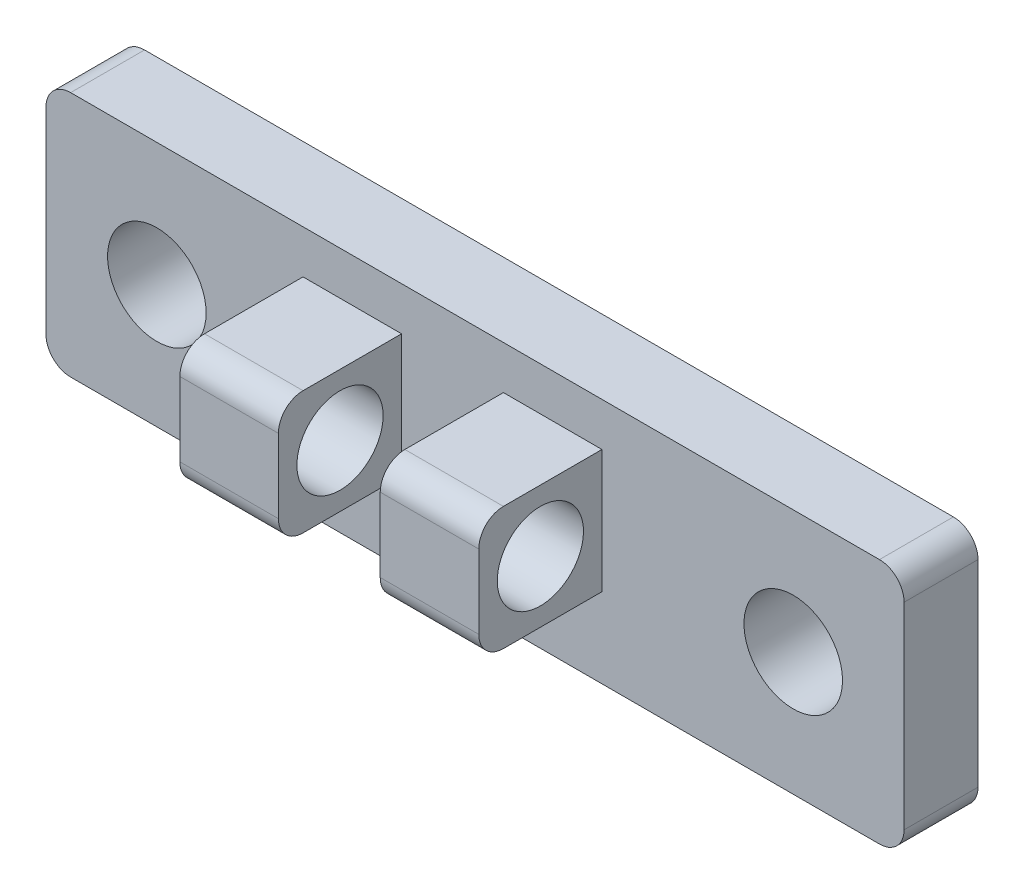
ISO-10303-21;
HEADER;
FILE_DESCRIPTION(('STEP AP214'),'2;1');
FILE_NAME('part.step','',(''),(''),'','','');
FILE_SCHEMA(('AUTOMOTIVE_DESIGN { 1 0 10303 214 1 1 1 1 }'));
ENDSEC;
DATA;
#1=APPLICATION_CONTEXT('core data for automotive mechanical design processes');
#2=APPLICATION_PROTOCOL_DEFINITION('international standard','automotive_design',2000,#1);
#3=PRODUCT_CONTEXT('',#1,'mechanical');
#4=PRODUCT('Part','Part','',(#3));
#5=PRODUCT_RELATED_PRODUCT_CATEGORY('part','',(#4));
#6=PRODUCT_DEFINITION_FORMATION('','',#4);
#7=PRODUCT_DEFINITION_CONTEXT('part definition',#1,'design');
#8=PRODUCT_DEFINITION('design','',#6,#7);
#9=PRODUCT_DEFINITION_SHAPE('','',#8);
#10=(LENGTH_UNIT() NAMED_UNIT(*) SI_UNIT(.MILLI.,.METRE.));
#11=(NAMED_UNIT(*) PLANE_ANGLE_UNIT() SI_UNIT($,.RADIAN.));
#12=(NAMED_UNIT(*) SI_UNIT($,.STERADIAN.) SOLID_ANGLE_UNIT());
#13=UNCERTAINTY_MEASURE_WITH_UNIT(LENGTH_MEASURE(1.E-05),#10,'distance_accuracy_value','');
#14=(GEOMETRIC_REPRESENTATION_CONTEXT(3) GLOBAL_UNCERTAINTY_ASSIGNED_CONTEXT((#13)) GLOBAL_UNIT_ASSIGNED_CONTEXT((#10,
#11,#12)) REPRESENTATION_CONTEXT('',''));
#15=CARTESIAN_POINT('',(0.,0.,0.));
#16=DIRECTION('',(0.,0.,1.));
#17=DIRECTION('',(1.,0.,0.));
#18=AXIS2_PLACEMENT_3D('',#15,#16,#17);
#19=CARTESIAN_POINT('',(0.,0.,3.));
#20=DIRECTION('',(0.,0.,1.));
#21=DIRECTION('',(1.,0.,0.));
#22=AXIS2_PLACEMENT_3D('',#19,#20,#21);
#23=PLANE('',#22);
#24=CARTESIAN_POINT('',(13.342342060041,-6.64128153895827,3.));
#25=DIRECTION('',(0.,0.,1.));
#26=DIRECTION('',(1.,0.,0.));
#27=AXIS2_PLACEMENT_3D('',#24,#25,#26);
#28=CIRCLE('',#27,2.);
#29=CARTESIAN_POINT('',(15.342342060041,-6.64128153895827,3.));
#30=VERTEX_POINT('',#29);
#31=EDGE_CURVE('E356',#30,#30,#28,.T.);
#32=ORIENTED_EDGE('',*,*,#31,.F.);
#33=EDGE_LOOP('',(#32));
#34=FACE_BOUND('',#33,.T.);
#35=CARTESIAN_POINT('',(-12.487657939959,-6.64128153895828,3.));
#36=DIRECTION('',(0.,0.,1.));
#37=DIRECTION('',(1.,0.,0.));
#38=AXIS2_PLACEMENT_3D('',#35,#36,#37);
#39=CIRCLE('',#38,2.);
#40=CARTESIAN_POINT('',(-10.487657939959,-6.64128153895828,3.));
#41=VERTEX_POINT('',#40);
#42=EDGE_CURVE('E351',#41,#41,#39,.T.);
#43=ORIENTED_EDGE('',*,*,#42,.F.);
#44=EDGE_LOOP('',(#43));
#45=FACE_BOUND('',#44,.T.);
#46=DIRECTION('',(1.,0.,0.));
#47=VECTOR('',#46,1.);
#48=CARTESIAN_POINT('',(16.992342060041,-11.6412815389583,3.));
#49=LINE('',#48,#47);
#50=CARTESIAN_POINT('',(-15.987657939959,-11.6412815389583,3.));
#51=VERTEX_POINT('',#50);
#52=CARTESIAN_POINT('',(16.842342060041,-11.6412815389583,3.));
#53=VERTEX_POINT('',#52);
#54=EDGE_CURVE('E257',#51,#53,#49,.T.);
#55=ORIENTED_EDGE('',*,*,#54,.T.);
#56=CARTESIAN_POINT('',(16.842342060041,-10.6412815389583,3.));
#57=DIRECTION('',(0.,0.,1.));
#58=DIRECTION('',(1.,0.,0.));
#59=AXIS2_PLACEMENT_3D('',#56,#57,#58);
#60=CIRCLE('',#59,1.);
#61=CARTESIAN_POINT('',(17.842342060041,-10.6412815389583,3.));
#62=VERTEX_POINT('',#61);
#63=EDGE_CURVE('E329',#53,#62,#60,.T.);
#64=ORIENTED_EDGE('',*,*,#63,.T.);
#65=DIRECTION('',(0.,1.,0.));
#66=VECTOR('',#65,1.);
#67=CARTESIAN_POINT('',(17.842342060041,-11.6412815389583,3.));
#68=LINE('',#67,#66);
#69=CARTESIAN_POINT('',(17.842342060041,-2.64128153895828,3.));
#70=VERTEX_POINT('',#69);
#71=EDGE_CURVE('E261',#62,#70,#68,.T.);
#72=ORIENTED_EDGE('',*,*,#71,.T.);
#73=CARTESIAN_POINT('',(16.842342060041,-2.64128153895827,3.));
#74=DIRECTION('',(0.,0.,1.));
#75=DIRECTION('',(1.,0.,0.));
#76=AXIS2_PLACEMENT_3D('',#73,#74,#75);
#77=CIRCLE('',#76,1.);
#78=CARTESIAN_POINT('',(16.842342060041,-1.64128153895827,3.));
#79=VERTEX_POINT('',#78);
#80=EDGE_CURVE('E326',#70,#79,#77,.T.);
#81=ORIENTED_EDGE('',*,*,#80,.T.);
#82=DIRECTION('',(-1.,0.,0.));
#83=VECTOR('',#82,1.);
#84=CARTESIAN_POINT('',(17.842342060041,-1.64128153895827,3.));
#85=LINE('',#84,#83);
#86=CARTESIAN_POINT('',(-15.987657939959,-1.64128153895827,3.));
#87=VERTEX_POINT('',#86);
#88=EDGE_CURVE('E266',#79,#87,#85,.T.);
#89=ORIENTED_EDGE('',*,*,#88,.T.);
#90=CARTESIAN_POINT('',(-15.987657939959,-2.64128153895827,3.));
#91=DIRECTION('',(0.,0.,1.));
#92=DIRECTION('',(1.,0.,0.));
#93=AXIS2_PLACEMENT_3D('',#90,#91,#92);
#94=CIRCLE('',#93,1.);
#95=CARTESIAN_POINT('',(-16.987657939959,-2.64128153895827,3.));
#96=VERTEX_POINT('',#95);
#97=EDGE_CURVE('E323',#87,#96,#94,.T.);
#98=ORIENTED_EDGE('',*,*,#97,.T.);
#99=DIRECTION('',(0.,1.,0.));
#100=VECTOR('',#99,1.);
#101=CARTESIAN_POINT('',(-16.987657939959,-2.49128153895828,3.));
#102=LINE('',#101,#100);
#103=CARTESIAN_POINT('',(-16.987657939959,-10.6412815389583,3.));
#104=VERTEX_POINT('',#103);
#105=EDGE_CURVE('E270',#104,#96,#102,.T.);
#106=ORIENTED_EDGE('',*,*,#105,.F.);
#107=CARTESIAN_POINT('',(-15.987657939959,-10.6412815389583,3.));
#108=DIRECTION('',(0.,0.,1.));
#109=DIRECTION('',(1.,0.,0.));
#110=AXIS2_PLACEMENT_3D('',#107,#108,#109);
#111=CIRCLE('',#110,1.);
#112=EDGE_CURVE('E320',#104,#51,#111,.T.);
#113=ORIENTED_EDGE('',*,*,#112,.T.);
#114=EDGE_LOOP('',(#55,#64,#72,#81,#89,#98,#106,#113));
#115=FACE_BOUND('',#114,.T.);
#116=DIRECTION('',(1.,0.,0.));
#117=VECTOR('',#116,1.);
#118=CARTESIAN_POINT('',(-2.55456594162026,-8.40243256363434,3.));
#119=LINE('',#118,#117);
#120=CARTESIAN_POINT('',(-6.55456594162026,-8.40243256363434,3.));
#121=VERTEX_POINT('',#120);
#122=CARTESIAN_POINT('',(-2.55456594162026,-8.40243256363434,3.));
#123=VERTEX_POINT('',#122);
#124=EDGE_CURVE('E234',#121,#123,#119,.T.);
#125=ORIENTED_EDGE('',*,*,#124,.F.);
#126=DIRECTION('',(0.,-1.,0.));
#127=VECTOR('',#126,1.);
#128=CARTESIAN_POINT('',(-6.55456594162026,-8.40243256363434,3.));
#129=LINE('',#128,#127);
#130=CARTESIAN_POINT('',(-6.55456594162026,-3.40243256363434,3.));
#131=VERTEX_POINT('',#130);
#132=EDGE_CURVE('E187',#131,#121,#129,.T.);
#133=ORIENTED_EDGE('',*,*,#132,.F.);
#134=DIRECTION('',(-1.,0.,0.));
#135=VECTOR('',#134,1.);
#136=CARTESIAN_POINT('',(-2.55456594162026,-3.40243256363434,3.));
#137=LINE('',#136,#135);
#138=CARTESIAN_POINT('',(-2.55456594162026,-3.40243256363434,3.));
#139=VERTEX_POINT('',#138);
#140=EDGE_CURVE('E226',#139,#131,#137,.T.);
#141=ORIENTED_EDGE('',*,*,#140,.F.);
#142=DIRECTION('',(0.,1.,0.));
#143=VECTOR('',#142,1.);
#144=CARTESIAN_POINT('',(-2.55456594162026,-8.40243256363434,3.));
#145=LINE('',#144,#143);
#146=EDGE_CURVE('E238',#123,#139,#145,.T.);
#147=ORIENTED_EDGE('',*,*,#146,.F.);
#148=EDGE_LOOP('',(#125,#133,#141,#147));
#149=FACE_BOUND('',#148,.T.);
#150=DIRECTION('',(-1.,0.,0.));
#151=VECTOR('',#150,1.);
#152=CARTESIAN_POINT('',(5.57876605837975,-3.40243256363433,3.));
#153=LINE('',#152,#151);
#154=CARTESIAN_POINT('',(5.57876605837975,-3.40243256363433,3.));
#155=VERTEX_POINT('',#154);
#156=CARTESIAN_POINT('',(1.57876605837973,-3.40243256363433,3.));
#157=VERTEX_POINT('',#156);
#158=EDGE_CURVE('E181',#155,#157,#153,.T.);
#159=ORIENTED_EDGE('',*,*,#158,.F.);
#160=DIRECTION('',(0.,1.,0.));
#161=VECTOR('',#160,1.);
#162=CARTESIAN_POINT('',(5.57876605837975,-8.40243256363432,3.));
#163=LINE('',#162,#161);
#164=CARTESIAN_POINT('',(5.57876605837975,-8.40243256363432,3.));
#165=VERTEX_POINT('',#164);
#166=EDGE_CURVE('E191',#165,#155,#163,.T.);
#167=ORIENTED_EDGE('',*,*,#166,.F.);
#168=DIRECTION('',(1.,0.,0.));
#169=VECTOR('',#168,1.);
#170=CARTESIAN_POINT('',(5.57876605837975,-8.40243256363432,3.));
#171=LINE('',#170,#169);
#172=CARTESIAN_POINT('',(1.57876605837975,-8.40243256363433,3.));
#173=VERTEX_POINT('',#172);
#174=EDGE_CURVE('E206',#173,#165,#171,.T.);
#175=ORIENTED_EDGE('',*,*,#174,.F.);
#176=DIRECTION('',(0.,-1.,0.));
#177=VECTOR('',#176,1.);
#178=CARTESIAN_POINT('',(1.57876605837975,-8.40243256363433,3.));
#179=LINE('',#178,#177);
#180=EDGE_CURVE('E202',#157,#173,#179,.T.);
#181=ORIENTED_EDGE('',*,*,#180,.F.);
#182=EDGE_LOOP('',(#159,#167,#175,#181));
#183=FACE_BOUND('',#182,.T.);
#184=ADVANCED_FACE('F39',(#34,#45,#115,#149,#183),#23,.T.);
#185=CARTESIAN_POINT('',(17.842342060041,-3.32128153895828,3.));
#186=DIRECTION('',(-1.,0.,0.));
#187=DIRECTION('',(0.,0.,1.));
#188=AXIS2_PLACEMENT_3D('',#185,#186,#187);
#189=PLANE('',#188);
#190=ORIENTED_EDGE('',*,*,#71,.F.);
#191=DIRECTION('',(0.,0.,-1.));
#192=VECTOR('',#191,1.);
#193=CARTESIAN_POINT('',(17.842342060041,-10.6412815389583,0.));
#194=LINE('',#193,#192);
#195=CARTESIAN_POINT('',(17.842342060041,-10.6412815389583,0.));
#196=VERTEX_POINT('',#195);
#197=EDGE_CURVE('E297',#62,#196,#194,.T.);
#198=ORIENTED_EDGE('',*,*,#197,.T.);
#199=DIRECTION('',(0.,1.,0.));
#200=VECTOR('',#199,1.);
#201=CARTESIAN_POINT('',(17.842342060041,-3.32128153895828,0.));
#202=LINE('',#201,#200);
#203=CARTESIAN_POINT('',(17.842342060041,-2.64128153895827,0.));
#204=VERTEX_POINT('',#203);
#205=EDGE_CURVE('E256',#196,#204,#202,.T.);
#206=ORIENTED_EDGE('',*,*,#205,.T.);
#207=DIRECTION('',(0.,0.,-1.));
#208=VECTOR('',#207,1.);
#209=CARTESIAN_POINT('',(17.842342060041,-2.64128153895827,3.));
#210=LINE('',#209,#208);
#211=EDGE_CURVE('E274',#204,#70,#210,.F.);
#212=ORIENTED_EDGE('',*,*,#211,.T.);
#213=EDGE_LOOP('',(#190,#198,#206,#212));
#214=FACE_BOUND('',#213,.T.);
#215=ADVANCED_FACE('F437',(#214),#189,.F.);
#216=CARTESIAN_POINT('',(-16.987657939959,-1.64128153895827,3.));
#217=DIRECTION('',(0.,1.,0.));
#218=DIRECTION('',(0.,0.,1.));
#219=AXIS2_PLACEMENT_3D('',#216,#217,#218);
#220=PLANE('',#219);
#221=ORIENTED_EDGE('',*,*,#88,.F.);
#222=DIRECTION('',(0.,0.,-1.));
#223=VECTOR('',#222,1.);
#224=CARTESIAN_POINT('',(16.842342060041,-1.64128153895827,0.));
#225=LINE('',#224,#223);
#226=CARTESIAN_POINT('',(16.842342060041,-1.64128153895827,0.));
#227=VERTEX_POINT('',#226);
#228=EDGE_CURVE('E335',#79,#227,#225,.T.);
#229=ORIENTED_EDGE('',*,*,#228,.T.);
#230=DIRECTION('',(1.,0.,0.));
#231=VECTOR('',#230,1.);
#232=CARTESIAN_POINT('',(-16.987657939959,-1.64128153895827,0.));
#233=LINE('',#232,#231);
#234=CARTESIAN_POINT('',(-15.987657939959,-1.64128153895827,0.));
#235=VERTEX_POINT('',#234);
#236=EDGE_CURVE('E278',#235,#227,#233,.T.);
#237=ORIENTED_EDGE('',*,*,#236,.F.);
#238=DIRECTION('',(0.,0.,-1.));
#239=VECTOR('',#238,1.);
#240=CARTESIAN_POINT('',(-15.987657939959,-1.64128153895827,3.));
#241=LINE('',#240,#239);
#242=EDGE_CURVE('E332',#235,#87,#241,.F.);
#243=ORIENTED_EDGE('',*,*,#242,.T.);
#244=EDGE_LOOP('',(#221,#229,#237,#243));
#245=FACE_BOUND('',#244,.T.);
#246=ADVANCED_FACE('F502',(#245),#220,.T.);
#247=CARTESIAN_POINT('',(-16.987657939959,-9.50548162912629,3.));
#248=DIRECTION('',(1.,0.,0.));
#249=DIRECTION('',(0.,0.,-1.));
#250=AXIS2_PLACEMENT_3D('',#247,#248,#249);
#251=PLANE('',#250);
#252=ORIENTED_EDGE('',*,*,#105,.T.);
#253=DIRECTION('',(0.,0.,-1.));
#254=VECTOR('',#253,1.);
#255=CARTESIAN_POINT('',(-16.987657939959,-2.64128153895827,0.));
#256=LINE('',#255,#254);
#257=CARTESIAN_POINT('',(-16.987657939959,-2.64128153895827,0.));
#258=VERTEX_POINT('',#257);
#259=EDGE_CURVE('E342',#96,#258,#256,.T.);
#260=ORIENTED_EDGE('',*,*,#259,.T.);
#261=DIRECTION('',(0.,-1.,0.));
#262=VECTOR('',#261,1.);
#263=CARTESIAN_POINT('',(-16.987657939959,-9.50548162912629,0.));
#264=LINE('',#263,#262);
#265=CARTESIAN_POINT('',(-16.987657939959,-10.6412815389583,0.));
#266=VERTEX_POINT('',#265);
#267=EDGE_CURVE('E282',#258,#266,#264,.T.);
#268=ORIENTED_EDGE('',*,*,#267,.T.);
#269=DIRECTION('',(0.,0.,-1.));
#270=VECTOR('',#269,1.);
#271=CARTESIAN_POINT('',(-16.987657939959,-10.6412815389583,3.));
#272=LINE('',#271,#270);
#273=EDGE_CURVE('E339',#266,#104,#272,.F.);
#274=ORIENTED_EDGE('',*,*,#273,.T.);
#275=EDGE_LOOP('',(#252,#260,#268,#274));
#276=FACE_BOUND('',#275,.T.);
#277=ADVANCED_FACE('F506',(#276),#251,.F.);
#278=CARTESIAN_POINT('',(16.992342060041,-11.6412815389583,3.));
#279=DIRECTION('',(0.,-1.,0.));
#280=DIRECTION('',(1.,0.,0.));
#281=AXIS2_PLACEMENT_3D('',#278,#279,#280);
#282=PLANE('',#281);
#283=DIRECTION('',(-1.,0.,0.));
#284=VECTOR('',#283,1.);
#285=CARTESIAN_POINT('',(16.992342060041,-11.6412815389583,0.));
#286=LINE('',#285,#284);
#287=CARTESIAN_POINT('',(16.842342060041,-11.6412815389583,0.));
#288=VERTEX_POINT('',#287);
#289=CARTESIAN_POINT('',(-15.987657939959,-11.6412815389583,0.));
#290=VERTEX_POINT('',#289);
#291=EDGE_CURVE('E262',#288,#290,#286,.T.);
#292=ORIENTED_EDGE('',*,*,#291,.F.);
#293=DIRECTION('',(0.,0.,-1.));
#294=VECTOR('',#293,1.);
#295=CARTESIAN_POINT('',(16.842342060041,-11.6412815389583,3.));
#296=LINE('',#295,#294);
#297=EDGE_CURVE('E317',#288,#53,#296,.F.);
#298=ORIENTED_EDGE('',*,*,#297,.T.);
#299=ORIENTED_EDGE('',*,*,#54,.F.);
#300=DIRECTION('',(0.,0.,-1.));
#301=VECTOR('',#300,1.);
#302=CARTESIAN_POINT('',(-15.987657939959,-11.6412815389583,0.));
#303=LINE('',#302,#301);
#304=EDGE_CURVE('E313',#51,#290,#303,.T.);
#305=ORIENTED_EDGE('',*,*,#304,.T.);
#306=EDGE_LOOP('',(#292,#298,#299,#305));
#307=FACE_BOUND('',#306,.T.);
#308=ADVANCED_FACE('F510',(#307),#282,.T.);
#309=CARTESIAN_POINT('',(0.,0.,0.));
#310=DIRECTION('',(0.,0.,1.));
#311=DIRECTION('',(1.,0.,0.));
#312=AXIS2_PLACEMENT_3D('',#309,#310,#311);
#313=PLANE('',#312);
#314=CARTESIAN_POINT('',(13.342342060041,-6.64128153895827,0.));
#315=DIRECTION('',(0.,0.,1.));
#316=DIRECTION('',(1.,0.,0.));
#317=AXIS2_PLACEMENT_3D('',#314,#315,#316);
#318=CIRCLE('',#317,2.);
#319=CARTESIAN_POINT('',(15.342342060041,-6.64128153895827,0.));
#320=VERTEX_POINT('',#319);
#321=EDGE_CURVE('E352',#320,#320,#318,.T.);
#322=ORIENTED_EDGE('',*,*,#321,.T.);
#323=EDGE_LOOP('',(#322));
#324=FACE_BOUND('',#323,.T.);
#325=CARTESIAN_POINT('',(-12.487657939959,-6.64128153895828,0.));
#326=DIRECTION('',(0.,0.,1.));
#327=DIRECTION('',(1.,0.,0.));
#328=AXIS2_PLACEMENT_3D('',#325,#326,#327);
#329=CIRCLE('',#328,2.);
#330=CARTESIAN_POINT('',(-10.487657939959,-6.64128153895828,0.));
#331=VERTEX_POINT('',#330);
#332=EDGE_CURVE('E347',#331,#331,#329,.T.);
#333=ORIENTED_EDGE('',*,*,#332,.T.);
#334=EDGE_LOOP('',(#333));
#335=FACE_BOUND('',#334,.T.);
#336=ORIENTED_EDGE('',*,*,#205,.F.);
#337=CARTESIAN_POINT('',(16.842342060041,-10.6412815389583,0.));
#338=DIRECTION('',(0.,0.,1.));
#339=DIRECTION('',(1.,0.,0.));
#340=AXIS2_PLACEMENT_3D('',#337,#338,#339);
#341=CIRCLE('',#340,1.);
#342=EDGE_CURVE('E310',#196,#288,#341,.F.);
#343=ORIENTED_EDGE('',*,*,#342,.T.);
#344=ORIENTED_EDGE('',*,*,#291,.T.);
#345=CARTESIAN_POINT('',(-15.987657939959,-10.6412815389583,0.));
#346=DIRECTION('',(0.,0.,1.));
#347=DIRECTION('',(1.,0.,0.));
#348=AXIS2_PLACEMENT_3D('',#345,#346,#347);
#349=CIRCLE('',#348,1.);
#350=EDGE_CURVE('E301',#290,#266,#349,.F.);
#351=ORIENTED_EDGE('',*,*,#350,.T.);
#352=ORIENTED_EDGE('',*,*,#267,.F.);
#353=CARTESIAN_POINT('',(-15.987657939959,-2.64128153895827,0.));
#354=DIRECTION('',(0.,0.,1.));
#355=DIRECTION('',(1.,0.,0.));
#356=AXIS2_PLACEMENT_3D('',#353,#354,#355);
#357=CIRCLE('',#356,1.);
#358=EDGE_CURVE('E304',#258,#235,#357,.F.);
#359=ORIENTED_EDGE('',*,*,#358,.T.);
#360=ORIENTED_EDGE('',*,*,#236,.T.);
#361=CARTESIAN_POINT('',(16.842342060041,-2.64128153895827,0.));
#362=DIRECTION('',(0.,0.,1.));
#363=DIRECTION('',(1.,0.,0.));
#364=AXIS2_PLACEMENT_3D('',#361,#362,#363);
#365=CIRCLE('',#364,1.);
#366=EDGE_CURVE('E307',#227,#204,#365,.F.);
#367=ORIENTED_EDGE('',*,*,#366,.T.);
#368=EDGE_LOOP('',(#336,#343,#344,#351,#352,#359,#360,#367));
#369=FACE_BOUND('',#368,.T.);
#370=ADVANCED_FACE('F514',(#324,#335,#369),#313,.F.);
#371=CARTESIAN_POINT('',(-6.55456594162026,-8.40243256363434,8.));
#372=DIRECTION('',(1.,0.,0.));
#373=DIRECTION('',(0.,0.,-1.));
#374=AXIS2_PLACEMENT_3D('',#371,#372,#373);
#375=PLANE('',#374);
#376=CARTESIAN_POINT('',(-6.55456594162026,-5.90243256363437,5.5));
#377=DIRECTION('',(1.,0.,0.));
#378=DIRECTION('',(0.,0.,-1.));
#379=AXIS2_PLACEMENT_3D('',#376,#377,#378);
#380=CIRCLE('',#379,1.75);
#381=CARTESIAN_POINT('',(-6.55456594162026,-5.90243256363437,3.75));
#382=VERTEX_POINT('',#381);
#383=EDGE_CURVE('E199',#382,#382,#380,.T.);
#384=ORIENTED_EDGE('',*,*,#383,.T.);
#385=EDGE_LOOP('',(#384));
#386=FACE_BOUND('',#385,.T.);
#387=DIRECTION('',(0.,0.,-1.));
#388=VECTOR('',#387,1.);
#389=CARTESIAN_POINT('',(-6.55456594162026,-8.40243256363434,8.));
#390=LINE('',#389,#388);
#391=CARTESIAN_POINT('',(-6.55456594162026,-8.40243256363434,7.));
#392=VERTEX_POINT('',#391);
#393=EDGE_CURVE('E253',#392,#121,#390,.T.);
#394=ORIENTED_EDGE('',*,*,#393,.F.);
#395=CARTESIAN_POINT('',(-6.55456594162026,-7.40243256363434,7.));
#396=DIRECTION('',(1.,0.,0.));
#397=DIRECTION('',(0.,0.,-1.));
#398=AXIS2_PLACEMENT_3D('',#395,#396,#397);
#399=CIRCLE('',#398,1.);
#400=CARTESIAN_POINT('',(-6.55456594162026,-7.40243256363434,8.));
#401=VERTEX_POINT('',#400);
#402=EDGE_CURVE('E376',#392,#401,#399,.F.);
#403=ORIENTED_EDGE('',*,*,#402,.T.);
#404=DIRECTION('',(0.,-1.,0.));
#405=VECTOR('',#404,1.);
#406=CARTESIAN_POINT('',(-6.55456594162026,-8.40243256363434,8.));
#407=LINE('',#406,#405);
#408=CARTESIAN_POINT('',(-6.55456594162026,-4.40243256363434,8.));
#409=VERTEX_POINT('',#408);
#410=EDGE_CURVE('E221',#409,#401,#407,.T.);
#411=ORIENTED_EDGE('',*,*,#410,.F.);
#412=CARTESIAN_POINT('',(-6.55456594162026,-4.40243256363434,7.));
#413=DIRECTION('',(1.,0.,0.));
#414=DIRECTION('',(0.,0.,-1.));
#415=AXIS2_PLACEMENT_3D('',#412,#413,#414);
#416=CIRCLE('',#415,1.);
#417=CARTESIAN_POINT('',(-6.55456594162026,-3.40243256363434,7.));
#418=VERTEX_POINT('',#417);
#419=EDGE_CURVE('E373',#409,#418,#416,.F.);
#420=ORIENTED_EDGE('',*,*,#419,.T.);
#421=DIRECTION('',(0.,0.,-1.));
#422=VECTOR('',#421,1.);
#423=CARTESIAN_POINT('',(-6.55456594162026,-3.40243256363434,8.));
#424=LINE('',#423,#422);
#425=EDGE_CURVE('E230',#418,#131,#424,.T.);
#426=ORIENTED_EDGE('',*,*,#425,.T.);
#427=ORIENTED_EDGE('',*,*,#132,.T.);
#428=EDGE_LOOP('',(#394,#403,#411,#420,#426,#427));
#429=FACE_BOUND('',#428,.T.);
#430=ADVANCED_FACE('F455',(#386,#429),#375,.F.);
#431=CARTESIAN_POINT('',(-2.55456594162026,-8.40243256363434,8.));
#432=DIRECTION('',(0.,1.,0.));
#433=DIRECTION('',(0.,0.,1.));
#434=AXIS2_PLACEMENT_3D('',#431,#432,#433);
#435=PLANE('',#434);
#436=DIRECTION('',(0.,0.,-1.));
#437=VECTOR('',#436,1.);
#438=CARTESIAN_POINT('',(-2.55456594162026,-8.40243256363434,8.));
#439=LINE('',#438,#437);
#440=CARTESIAN_POINT('',(-2.55456594162026,-8.40243256363434,7.));
#441=VERTEX_POINT('',#440);
#442=EDGE_CURVE('E250',#441,#123,#439,.T.);
#443=ORIENTED_EDGE('',*,*,#442,.F.);
#444=DIRECTION('',(1.,0.,0.));
#445=VECTOR('',#444,1.);
#446=CARTESIAN_POINT('',(-6.55456594162026,-8.40243256363434,7.));
#447=LINE('',#446,#445);
#448=EDGE_CURVE('E370',#441,#392,#447,.F.);
#449=ORIENTED_EDGE('',*,*,#448,.T.);
#450=ORIENTED_EDGE('',*,*,#393,.T.);
#451=ORIENTED_EDGE('',*,*,#124,.T.);
#452=EDGE_LOOP('',(#443,#449,#450,#451));
#453=FACE_BOUND('',#452,.T.);
#454=ADVANCED_FACE('F450',(#453),#435,.F.);
#455=CARTESIAN_POINT('',(-2.55456594162026,-8.40243256363434,8.));
#456=DIRECTION('',(-1.,0.,0.));
#457=DIRECTION('',(0.,-1.,0.));
#458=AXIS2_PLACEMENT_3D('',#455,#456,#457);
#459=PLANE('',#458);
#460=CARTESIAN_POINT('',(-2.55456594162026,-5.90243256363436,5.5));
#461=DIRECTION('',(-1.,0.,0.));
#462=DIRECTION('',(0.,-1.,0.));
#463=AXIS2_PLACEMENT_3D('',#460,#461,#462);
#464=CIRCLE('',#463,1.75);
#465=CARTESIAN_POINT('',(-2.55456594162026,-7.65243256363436,5.5));
#466=VERTEX_POINT('',#465);
#467=EDGE_CURVE('E293',#466,#466,#464,.T.);
#468=ORIENTED_EDGE('',*,*,#467,.T.);
#469=EDGE_LOOP('',(#468));
#470=FACE_BOUND('',#469,.T.);
#471=DIRECTION('',(0.,1.,0.));
#472=VECTOR('',#471,1.);
#473=CARTESIAN_POINT('',(-2.55456594162026,-8.40243256363434,8.));
#474=LINE('',#473,#472);
#475=CARTESIAN_POINT('',(-2.55456594162026,-7.40243256363434,8.));
#476=VERTEX_POINT('',#475);
#477=CARTESIAN_POINT('',(-2.55456594162026,-4.40243256363434,8.));
#478=VERTEX_POINT('',#477);
#479=EDGE_CURVE('E225',#476,#478,#474,.T.);
#480=ORIENTED_EDGE('',*,*,#479,.F.);
#481=CARTESIAN_POINT('',(-2.55456594162026,-7.40243256363434,7.));
#482=DIRECTION('',(-1.,0.,0.));
#483=DIRECTION('',(0.,-1.,0.));
#484=AXIS2_PLACEMENT_3D('',#481,#482,#483);
#485=CIRCLE('',#484,1.);
#486=EDGE_CURVE('E367',#476,#441,#485,.F.);
#487=ORIENTED_EDGE('',*,*,#486,.T.);
#488=ORIENTED_EDGE('',*,*,#442,.T.);
#489=ORIENTED_EDGE('',*,*,#146,.T.);
#490=DIRECTION('',(0.,0.,-1.));
#491=VECTOR('',#490,1.);
#492=CARTESIAN_POINT('',(-2.55456594162026,-3.40243256363434,8.));
#493=LINE('',#492,#491);
#494=CARTESIAN_POINT('',(-2.55456594162026,-3.40243256363434,7.));
#495=VERTEX_POINT('',#494);
#496=EDGE_CURVE('E247',#495,#139,#493,.T.);
#497=ORIENTED_EDGE('',*,*,#496,.F.);
#498=CARTESIAN_POINT('',(-2.55456594162026,-4.40243256363434,7.));
#499=DIRECTION('',(-1.,0.,0.));
#500=DIRECTION('',(0.,-1.,0.));
#501=AXIS2_PLACEMENT_3D('',#498,#499,#500);
#502=CIRCLE('',#501,1.);
#503=EDGE_CURVE('E364',#495,#478,#502,.F.);
#504=ORIENTED_EDGE('',*,*,#503,.T.);
#505=EDGE_LOOP('',(#480,#487,#488,#489,#497,#504));
#506=FACE_BOUND('',#505,.T.);
#507=ADVANCED_FACE('F465',(#470,#506),#459,.F.);
#508=CARTESIAN_POINT('',(-2.55456594162026,-3.40243256363434,8.));
#509=DIRECTION('',(0.,-1.,0.));
#510=DIRECTION('',(0.,0.,-1.));
#511=AXIS2_PLACEMENT_3D('',#508,#509,#510);
#512=PLANE('',#511);
#513=ORIENTED_EDGE('',*,*,#425,.F.);
#514=DIRECTION('',(-1.,0.,0.));
#515=VECTOR('',#514,1.);
#516=CARTESIAN_POINT('',(-2.55456594162026,-3.40243256363434,7.));
#517=LINE('',#516,#515);
#518=EDGE_CURVE('E379',#418,#495,#517,.F.);
#519=ORIENTED_EDGE('',*,*,#518,.T.);
#520=ORIENTED_EDGE('',*,*,#496,.T.);
#521=ORIENTED_EDGE('',*,*,#140,.T.);
#522=EDGE_LOOP('',(#513,#519,#520,#521));
#523=FACE_BOUND('',#522,.T.);
#524=ADVANCED_FACE('F460',(#523),#512,.F.);
#525=CARTESIAN_POINT('',(0.,0.,8.));
#526=DIRECTION('',(0.,0.,1.));
#527=DIRECTION('',(1.,0.,0.));
#528=AXIS2_PLACEMENT_3D('',#525,#526,#527);
#529=PLANE('',#528);
#530=ORIENTED_EDGE('',*,*,#410,.T.);
#531=DIRECTION('',(1.,0.,0.));
#532=VECTOR('',#531,1.);
#533=CARTESIAN_POINT('',(-2.55456594162026,-7.40243256363434,8.));
#534=LINE('',#533,#532);
#535=EDGE_CURVE('E360',#401,#476,#534,.T.);
#536=ORIENTED_EDGE('',*,*,#535,.T.);
#537=ORIENTED_EDGE('',*,*,#479,.T.);
#538=DIRECTION('',(-1.,0.,0.));
#539=VECTOR('',#538,1.);
#540=CARTESIAN_POINT('',(-6.55456594162026,-4.40243256363434,8.));
#541=LINE('',#540,#539);
#542=EDGE_CURVE('E346',#478,#409,#541,.T.);
#543=ORIENTED_EDGE('',*,*,#542,.T.);
#544=EDGE_LOOP('',(#530,#536,#537,#543));
#545=FACE_BOUND('',#544,.T.);
#546=ADVANCED_FACE('F470',(#545),#529,.T.);
#547=CARTESIAN_POINT('',(5.57876605837975,-8.40243256363432,8.));
#548=DIRECTION('',(-1.,0.,0.));
#549=DIRECTION('',(0.,0.,1.));
#550=AXIS2_PLACEMENT_3D('',#547,#548,#549);
#551=PLANE('',#550);
#552=CARTESIAN_POINT('',(5.57876605837976,-5.90243256363434,5.5));
#553=DIRECTION('',(1.,0.,0.));
#554=DIRECTION('',(0.,1.,0.));
#555=AXIS2_PLACEMENT_3D('',#552,#553,#554);
#556=CIRCLE('',#555,1.75);
#557=CARTESIAN_POINT('',(5.57876605837976,-4.15243256363434,5.5));
#558=VERTEX_POINT('',#557);
#559=EDGE_CURVE('E294',#558,#558,#556,.T.);
#560=ORIENTED_EDGE('',*,*,#559,.F.);
#561=EDGE_LOOP('',(#560));
#562=FACE_BOUND('',#561,.T.);
#563=DIRECTION('',(0.,1.,0.));
#564=VECTOR('',#563,1.);
#565=CARTESIAN_POINT('',(5.57876605837975,-8.40243256363432,8.));
#566=LINE('',#565,#564);
#567=CARTESIAN_POINT('',(5.57876605837975,-7.40243256363432,8.));
#568=VERTEX_POINT('',#567);
#569=CARTESIAN_POINT('',(5.57876605837975,-4.40243256363433,8.));
#570=VERTEX_POINT('',#569);
#571=EDGE_CURVE('E212',#568,#570,#566,.T.);
#572=ORIENTED_EDGE('',*,*,#571,.F.);
#573=CARTESIAN_POINT('',(5.57876605837975,-7.40243256363432,7.));
#574=DIRECTION('',(-1.,0.,0.));
#575=DIRECTION('',(0.,0.,1.));
#576=AXIS2_PLACEMENT_3D('',#573,#574,#575);
#577=CIRCLE('',#576,1.);
#578=CARTESIAN_POINT('',(5.57876605837975,-8.40243256363432,7.));
#579=VERTEX_POINT('',#578);
#580=EDGE_CURVE('E393',#568,#579,#577,.F.);
#581=ORIENTED_EDGE('',*,*,#580,.T.);
#582=DIRECTION('',(0.,0.,-1.));
#583=VECTOR('',#582,1.);
#584=CARTESIAN_POINT('',(5.57876605837975,-8.40243256363432,8.));
#585=LINE('',#584,#583);
#586=EDGE_CURVE('E194',#579,#165,#585,.T.);
#587=ORIENTED_EDGE('',*,*,#586,.T.);
#588=ORIENTED_EDGE('',*,*,#166,.T.);
#589=DIRECTION('',(0.,0.,-1.));
#590=VECTOR('',#589,1.);
#591=CARTESIAN_POINT('',(5.57876605837975,-3.40243256363433,8.));
#592=LINE('',#591,#590);
#593=CARTESIAN_POINT('',(5.57876605837975,-3.40243256363433,7.));
#594=VERTEX_POINT('',#593);
#595=EDGE_CURVE('E177',#594,#155,#592,.T.);
#596=ORIENTED_EDGE('',*,*,#595,.F.);
#597=CARTESIAN_POINT('',(5.57876605837975,-4.40243256363433,7.));
#598=DIRECTION('',(-1.,0.,0.));
#599=DIRECTION('',(0.,0.,1.));
#600=AXIS2_PLACEMENT_3D('',#597,#598,#599);
#601=CIRCLE('',#600,1.);
#602=EDGE_CURVE('E390',#594,#570,#601,.F.);
#603=ORIENTED_EDGE('',*,*,#602,.T.);
#604=EDGE_LOOP('',(#572,#581,#587,#588,#596,#603));
#605=FACE_BOUND('',#604,.T.);
#606=ADVANCED_FACE('F193',(#562,#605),#551,.F.);
#607=CARTESIAN_POINT('',(5.57876605837975,-3.40243256363433,8.));
#608=DIRECTION('',(0.,-1.,0.));
#609=DIRECTION('',(0.,0.,-1.));
#610=AXIS2_PLACEMENT_3D('',#607,#608,#609);
#611=PLANE('',#610);
#612=DIRECTION('',(0.,0.,-1.));
#613=VECTOR('',#612,1.);
#614=CARTESIAN_POINT('',(1.57876605837973,-3.40243256363433,8.));
#615=LINE('',#614,#613);
#616=CARTESIAN_POINT('',(1.57876605837973,-3.40243256363433,7.));
#617=VERTEX_POINT('',#616);
#618=EDGE_CURVE('E188',#617,#157,#615,.T.);
#619=ORIENTED_EDGE('',*,*,#618,.F.);
#620=DIRECTION('',(-1.,0.,0.));
#621=VECTOR('',#620,1.);
#622=CARTESIAN_POINT('',(5.57876605837975,-3.40243256363433,7.));
#623=LINE('',#622,#621);
#624=EDGE_CURVE('E11',#617,#594,#623,.F.);
#625=ORIENTED_EDGE('',*,*,#624,.T.);
#626=ORIENTED_EDGE('',*,*,#595,.T.);
#627=ORIENTED_EDGE('',*,*,#158,.T.);
#628=EDGE_LOOP('',(#619,#625,#626,#627));
#629=FACE_BOUND('',#628,.T.);
#630=ADVANCED_FACE('F179',(#629),#611,.F.);
#631=CARTESIAN_POINT('',(1.57876605837975,-8.40243256363433,8.));
#632=DIRECTION('',(1.,0.,0.));
#633=DIRECTION('',(0.,1.,0.));
#634=AXIS2_PLACEMENT_3D('',#631,#632,#633);
#635=PLANE('',#634);
#636=CARTESIAN_POINT('',(1.57876605837974,-5.90243256363435,5.5));
#637=DIRECTION('',(1.,0.,0.));
#638=DIRECTION('',(0.,1.,0.));
#639=AXIS2_PLACEMENT_3D('',#636,#637,#638);
#640=CIRCLE('',#639,1.75);
#641=CARTESIAN_POINT('',(1.57876605837974,-4.15243256363435,5.5));
#642=VERTEX_POINT('',#641);
#643=EDGE_CURVE('E289',#642,#642,#640,.T.);
#644=ORIENTED_EDGE('',*,*,#643,.T.);
#645=EDGE_LOOP('',(#644));
#646=FACE_BOUND('',#645,.T.);
#647=DIRECTION('',(0.,0.,-1.));
#648=VECTOR('',#647,1.);
#649=CARTESIAN_POINT('',(1.57876605837975,-8.40243256363433,8.));
#650=LINE('',#649,#648);
#651=CARTESIAN_POINT('',(1.57876605837975,-8.40243256363433,7.));
#652=VERTEX_POINT('',#651);
#653=EDGE_CURVE('E215',#652,#173,#650,.T.);
#654=ORIENTED_EDGE('',*,*,#653,.F.);
#655=CARTESIAN_POINT('',(1.57876605837974,-7.40243256363433,7.));
#656=DIRECTION('',(1.,0.,0.));
#657=DIRECTION('',(0.,1.,0.));
#658=AXIS2_PLACEMENT_3D('',#655,#656,#657);
#659=CIRCLE('',#658,1.);
#660=CARTESIAN_POINT('',(1.57876605837974,-7.40243256363433,8.));
#661=VERTEX_POINT('',#660);
#662=EDGE_CURVE('E48',#652,#661,#659,.F.);
#663=ORIENTED_EDGE('',*,*,#662,.T.);
#664=DIRECTION('',(0.,-1.,0.));
#665=VECTOR('',#664,1.);
#666=CARTESIAN_POINT('',(1.57876605837975,-8.40243256363433,8.));
#667=LINE('',#666,#665);
#668=CARTESIAN_POINT('',(1.57876605837974,-4.40243256363433,8.));
#669=VERTEX_POINT('',#668);
#670=EDGE_CURVE('E216',#669,#661,#667,.T.);
#671=ORIENTED_EDGE('',*,*,#670,.F.);
#672=CARTESIAN_POINT('',(1.57876605837974,-4.40243256363433,7.));
#673=DIRECTION('',(1.,0.,0.));
#674=DIRECTION('',(0.,1.,0.));
#675=AXIS2_PLACEMENT_3D('',#672,#673,#674);
#676=CIRCLE('',#675,1.);
#677=EDGE_CURVE('E55',#669,#617,#676,.F.);
#678=ORIENTED_EDGE('',*,*,#677,.T.);
#679=ORIENTED_EDGE('',*,*,#618,.T.);
#680=ORIENTED_EDGE('',*,*,#180,.T.);
#681=EDGE_LOOP('',(#654,#663,#671,#678,#679,#680));
#682=FACE_BOUND('',#681,.T.);
#683=ADVANCED_FACE('F402',(#646,#682),#635,.F.);
#684=CARTESIAN_POINT('',(5.57876605837975,-8.40243256363432,8.));
#685=DIRECTION('',(0.,1.,0.));
#686=DIRECTION('',(-1.,0.,0.));
#687=AXIS2_PLACEMENT_3D('',#684,#685,#686);
#688=PLANE('',#687);
#689=ORIENTED_EDGE('',*,*,#586,.F.);
#690=DIRECTION('',(1.,0.,0.));
#691=VECTOR('',#690,1.);
#692=CARTESIAN_POINT('',(1.57876605837975,-8.40243256363433,7.));
#693=LINE('',#692,#691);
#694=EDGE_CURVE('E63',#579,#652,#693,.F.);
#695=ORIENTED_EDGE('',*,*,#694,.T.);
#696=ORIENTED_EDGE('',*,*,#653,.T.);
#697=ORIENTED_EDGE('',*,*,#174,.T.);
#698=EDGE_LOOP('',(#689,#695,#696,#697));
#699=FACE_BOUND('',#698,.T.);
#700=ADVANCED_FACE('F411',(#699),#688,.F.);
#701=CARTESIAN_POINT('',(0.,0.,8.));
#702=DIRECTION('',(0.,0.,1.));
#703=DIRECTION('',(1.,0.,0.));
#704=AXIS2_PLACEMENT_3D('',#701,#702,#703);
#705=PLANE('',#704);
#706=ORIENTED_EDGE('',*,*,#670,.T.);
#707=DIRECTION('',(1.,0.,0.));
#708=VECTOR('',#707,1.);
#709=CARTESIAN_POINT('',(5.57876605837974,-7.40243256363432,8.));
#710=LINE('',#709,#708);
#711=EDGE_CURVE('E386',#661,#568,#710,.T.);
#712=ORIENTED_EDGE('',*,*,#711,.T.);
#713=ORIENTED_EDGE('',*,*,#571,.T.);
#714=DIRECTION('',(-1.,0.,0.));
#715=VECTOR('',#714,1.);
#716=CARTESIAN_POINT('',(1.57876605837973,-4.40243256363433,8.));
#717=LINE('',#716,#715);
#718=EDGE_CURVE('E382',#570,#669,#717,.T.);
#719=ORIENTED_EDGE('',*,*,#718,.T.);
#720=EDGE_LOOP('',(#706,#712,#713,#719));
#721=FACE_BOUND('',#720,.T.);
#722=ADVANCED_FACE('F406',(#721),#705,.T.);
#723=CARTESIAN_POINT('',(-8.42123394162024,-5.90243256363437,5.5));
#724=DIRECTION('',(1.,0.,0.));
#725=DIRECTION('',(0.,1.,0.));
#726=AXIS2_PLACEMENT_3D('',#723,#724,#725);
#727=CYLINDRICAL_SURFACE('',#726,1.75);
#728=ORIENTED_EDGE('',*,*,#559,.T.);
#729=EDGE_LOOP('',(#728));
#730=FACE_BOUND('',#729,.T.);
#731=ORIENTED_EDGE('',*,*,#643,.F.);
#732=EDGE_LOOP('',(#731));
#733=FACE_BOUND('',#732,.T.);
#734=ADVANCED_FACE('F543',(#730,#733),#727,.F.);
#735=ORIENTED_EDGE('',*,*,#467,.F.);
#736=EDGE_LOOP('',(#735));
#737=FACE_BOUND('',#736,.T.);
#738=ORIENTED_EDGE('',*,*,#383,.F.);
#739=EDGE_LOOP('',(#738));
#740=FACE_BOUND('',#739,.T.);
#741=ADVANCED_FACE('F498',(#737,#740),#727,.F.);
#742=CARTESIAN_POINT('',(16.842342060041,-10.6412815389583,3.));
#743=DIRECTION('',(0.,0.,1.));
#744=DIRECTION('',(1.,0.,0.));
#745=AXIS2_PLACEMENT_3D('',#742,#743,#744);
#746=CYLINDRICAL_SURFACE('',#745,1.);
#747=ORIENTED_EDGE('',*,*,#63,.F.);
#748=ORIENTED_EDGE('',*,*,#297,.F.);
#749=ORIENTED_EDGE('',*,*,#342,.F.);
#750=ORIENTED_EDGE('',*,*,#197,.F.);
#751=EDGE_LOOP('',(#747,#748,#749,#750));
#752=FACE_BOUND('',#751,.T.);
#753=ADVANCED_FACE('F494',(#752),#746,.T.);
#754=CARTESIAN_POINT('',(16.842342060041,-2.64128153895827,3.));
#755=DIRECTION('',(0.,0.,1.));
#756=DIRECTION('',(1.,0.,0.));
#757=AXIS2_PLACEMENT_3D('',#754,#755,#756);
#758=CYLINDRICAL_SURFACE('',#757,1.);
#759=ORIENTED_EDGE('',*,*,#80,.F.);
#760=ORIENTED_EDGE('',*,*,#211,.F.);
#761=ORIENTED_EDGE('',*,*,#366,.F.);
#762=ORIENTED_EDGE('',*,*,#228,.F.);
#763=EDGE_LOOP('',(#759,#760,#761,#762));
#764=FACE_BOUND('',#763,.T.);
#765=ADVANCED_FACE('F490',(#764),#758,.T.);
#766=CARTESIAN_POINT('',(-15.987657939959,-2.64128153895827,3.));
#767=DIRECTION('',(0.,0.,1.));
#768=DIRECTION('',(1.,0.,0.));
#769=AXIS2_PLACEMENT_3D('',#766,#767,#768);
#770=CYLINDRICAL_SURFACE('',#769,1.);
#771=ORIENTED_EDGE('',*,*,#97,.F.);
#772=ORIENTED_EDGE('',*,*,#242,.F.);
#773=ORIENTED_EDGE('',*,*,#358,.F.);
#774=ORIENTED_EDGE('',*,*,#259,.F.);
#775=EDGE_LOOP('',(#771,#772,#773,#774));
#776=FACE_BOUND('',#775,.T.);
#777=ADVANCED_FACE('F486',(#776),#770,.T.);
#778=CARTESIAN_POINT('',(-15.987657939959,-10.6412815389583,3.));
#779=DIRECTION('',(0.,0.,1.));
#780=DIRECTION('',(1.,0.,0.));
#781=AXIS2_PLACEMENT_3D('',#778,#779,#780);
#782=CYLINDRICAL_SURFACE('',#781,1.);
#783=ORIENTED_EDGE('',*,*,#112,.F.);
#784=ORIENTED_EDGE('',*,*,#273,.F.);
#785=ORIENTED_EDGE('',*,*,#350,.F.);
#786=ORIENTED_EDGE('',*,*,#304,.F.);
#787=EDGE_LOOP('',(#783,#784,#785,#786));
#788=FACE_BOUND('',#787,.T.);
#789=ADVANCED_FACE('F482',(#788),#782,.T.);
#790=CARTESIAN_POINT('',(-12.487657939959,-6.64128153895828,-2.));
#791=DIRECTION('',(0.,0.,1.));
#792=DIRECTION('',(1.,0.,0.));
#793=AXIS2_PLACEMENT_3D('',#790,#791,#792);
#794=CYLINDRICAL_SURFACE('',#793,2.);
#795=ORIENTED_EDGE('',*,*,#42,.T.);
#796=EDGE_LOOP('',(#795));
#797=FACE_BOUND('',#796,.T.);
#798=ORIENTED_EDGE('',*,*,#332,.F.);
#799=EDGE_LOOP('',(#798));
#800=FACE_BOUND('',#799,.T.);
#801=ADVANCED_FACE('F485',(#797,#800),#794,.F.);
#802=CARTESIAN_POINT('',(13.342342060041,-6.64128153895827,-2.));
#803=DIRECTION('',(0.,0.,1.));
#804=DIRECTION('',(1.,0.,0.));
#805=AXIS2_PLACEMENT_3D('',#802,#803,#804);
#806=CYLINDRICAL_SURFACE('',#805,2.);
#807=ORIENTED_EDGE('',*,*,#31,.T.);
#808=EDGE_LOOP('',(#807));
#809=FACE_BOUND('',#808,.T.);
#810=ORIENTED_EDGE('',*,*,#321,.F.);
#811=EDGE_LOOP('',(#810));
#812=FACE_BOUND('',#811,.T.);
#813=ADVANCED_FACE('F432',(#809,#812),#806,.F.);
#814=CARTESIAN_POINT('',(0.,-7.40243256363434,7.));
#815=DIRECTION('',(-1.,0.,0.));
#816=DIRECTION('',(0.,0.,1.));
#817=AXIS2_PLACEMENT_3D('',#814,#815,#816);
#818=CYLINDRICAL_SURFACE('',#817,1.);
#819=ORIENTED_EDGE('',*,*,#402,.F.);
#820=ORIENTED_EDGE('',*,*,#448,.F.);
#821=ORIENTED_EDGE('',*,*,#486,.F.);
#822=ORIENTED_EDGE('',*,*,#535,.F.);
#823=EDGE_LOOP('',(#819,#820,#821,#822));
#824=FACE_BOUND('',#823,.T.);
#825=ADVANCED_FACE('F468',(#824),#818,.T.);
#826=CARTESIAN_POINT('',(0.,-4.40243256363434,7.));
#827=DIRECTION('',(1.,0.,0.));
#828=DIRECTION('',(0.,0.,-1.));
#829=AXIS2_PLACEMENT_3D('',#826,#827,#828);
#830=CYLINDRICAL_SURFACE('',#829,1.);
#831=ORIENTED_EDGE('',*,*,#503,.F.);
#832=ORIENTED_EDGE('',*,*,#518,.F.);
#833=ORIENTED_EDGE('',*,*,#419,.F.);
#834=ORIENTED_EDGE('',*,*,#542,.F.);
#835=EDGE_LOOP('',(#831,#832,#833,#834));
#836=FACE_BOUND('',#835,.T.);
#837=ADVANCED_FACE('F473',(#836),#830,.T.);
#838=CARTESIAN_POINT('',(0.,-7.40243256363434,7.));
#839=DIRECTION('',(-1.,0.,0.));
#840=DIRECTION('',(0.,-1.,0.));
#841=AXIS2_PLACEMENT_3D('',#838,#839,#840);
#842=CYLINDRICAL_SURFACE('',#841,1.);
#843=ORIENTED_EDGE('',*,*,#662,.F.);
#844=ORIENTED_EDGE('',*,*,#694,.F.);
#845=ORIENTED_EDGE('',*,*,#580,.F.);
#846=ORIENTED_EDGE('',*,*,#711,.F.);
#847=EDGE_LOOP('',(#843,#844,#845,#846));
#848=FACE_BOUND('',#847,.T.);
#849=ADVANCED_FACE('F410',(#848),#842,.T.);
#850=CARTESIAN_POINT('',(0.,-4.40243256363433,7.));
#851=DIRECTION('',(1.,0.,0.));
#852=DIRECTION('',(0.,0.,-1.));
#853=AXIS2_PLACEMENT_3D('',#850,#851,#852);
#854=CYLINDRICAL_SURFACE('',#853,1.);
#855=ORIENTED_EDGE('',*,*,#602,.F.);
#856=ORIENTED_EDGE('',*,*,#624,.F.);
#857=ORIENTED_EDGE('',*,*,#677,.F.);
#858=ORIENTED_EDGE('',*,*,#718,.F.);
#859=EDGE_LOOP('',(#855,#856,#857,#858));
#860=FACE_BOUND('',#859,.T.);
#861=ADVANCED_FACE('F41',(#860),#854,.T.);
#862=CLOSED_SHELL('',(#184,#215,#246,#277,#308,#370,#430,#454,#507,#524,#546,#606,#630,#683,
#700,#722,#734,#741,#753,#765,#777,#789,#801,#813,#825,#837,#849,#861));
#863=MANIFOLD_SOLID_BREP('B2',#862);
#864=ADVANCED_BREP_SHAPE_REPRESENTATION('',(#18,#863),#14);
#865=SHAPE_DEFINITION_REPRESENTATION(#9,#864);
ENDSEC;
END-ISO-10303-21;
